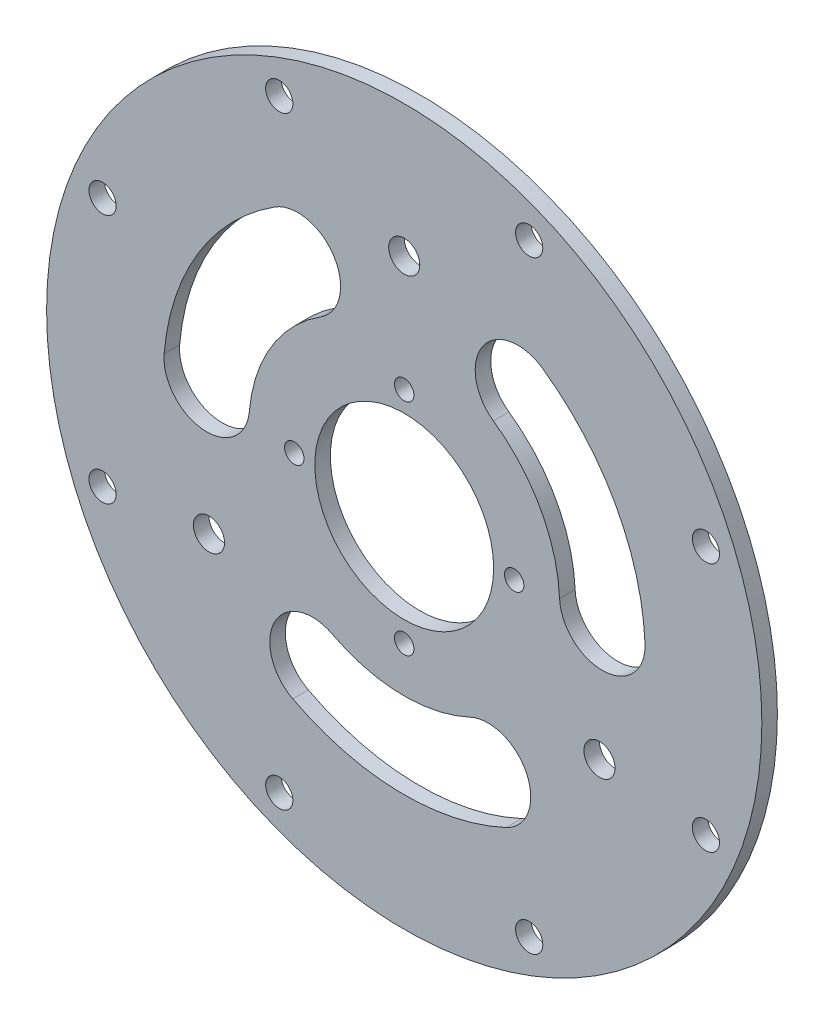
ISO-10303-21;
HEADER;
FILE_DESCRIPTION(('STEP AP214'),'2;1');
FILE_NAME('part.step','',(''),(''),'','','');
FILE_SCHEMA(('AUTOMOTIVE_DESIGN { 1 0 10303 214 1 1 1 1 }'));
ENDSEC;
DATA;
#1=APPLICATION_CONTEXT('core data for automotive mechanical design processes');
#2=APPLICATION_PROTOCOL_DEFINITION('international standard','automotive_design',2000,#1);
#3=PRODUCT_CONTEXT('',#1,'mechanical');
#4=PRODUCT('Part','Part','',(#3));
#5=PRODUCT_RELATED_PRODUCT_CATEGORY('part','',(#4));
#6=PRODUCT_DEFINITION_FORMATION('','',#4);
#7=PRODUCT_DEFINITION_CONTEXT('part definition',#1,'design');
#8=PRODUCT_DEFINITION('design','',#6,#7);
#9=PRODUCT_DEFINITION_SHAPE('','',#8);
#10=(LENGTH_UNIT() NAMED_UNIT(*) SI_UNIT(.MILLI.,.METRE.));
#11=(NAMED_UNIT(*) PLANE_ANGLE_UNIT() SI_UNIT($,.RADIAN.));
#12=(NAMED_UNIT(*) SI_UNIT($,.STERADIAN.) SOLID_ANGLE_UNIT());
#13=UNCERTAINTY_MEASURE_WITH_UNIT(LENGTH_MEASURE(1.E-05),#10,'distance_accuracy_value','');
#14=(GEOMETRIC_REPRESENTATION_CONTEXT(3) GLOBAL_UNCERTAINTY_ASSIGNED_CONTEXT((#13)) GLOBAL_UNIT_ASSIGNED_CONTEXT((#10,
#11,#12)) REPRESENTATION_CONTEXT('',''));
#15=CARTESIAN_POINT('',(0.,0.,0.));
#16=DIRECTION('',(0.,0.,1.));
#17=DIRECTION('',(1.,0.,0.));
#18=AXIS2_PLACEMENT_3D('',#15,#16,#17);
#19=CARTESIAN_POINT('',(0.,0.,2.));
#20=DIRECTION('',(0.,0.,1.));
#21=DIRECTION('',(1.,0.,0.));
#22=AXIS2_PLACEMENT_3D('',#19,#20,#21);
#23=PLANE('',#22);
#24=CARTESIAN_POINT('',(0.,14.1421356237309,2.));
#25=DIRECTION('',(0.,0.,1.));
#26=DIRECTION('',(1.,0.,0.));
#27=AXIS2_PLACEMENT_3D('',#24,#25,#26);
#28=CIRCLE('',#27,1.25);
#29=CARTESIAN_POINT('',(1.25,14.1421356237309,2.));
#30=VERTEX_POINT('',#29);
#31=EDGE_CURVE('E349',#30,#30,#28,.T.);
#32=ORIENTED_EDGE('',*,*,#31,.F.);
#33=EDGE_LOOP('',(#32));
#34=FACE_BOUND('',#33,.T.);
#35=CARTESIAN_POINT('',(14.1421356237309,0.,2.));
#36=DIRECTION('',(0.,0.,1.));
#37=DIRECTION('',(1.,0.,0.));
#38=AXIS2_PLACEMENT_3D('',#35,#36,#37);
#39=CIRCLE('',#38,1.25);
#40=CARTESIAN_POINT('',(15.3921356237309,0.,2.));
#41=VERTEX_POINT('',#40);
#42=EDGE_CURVE('E388',#41,#41,#39,.T.);
#43=ORIENTED_EDGE('',*,*,#42,.F.);
#44=EDGE_LOOP('',(#43));
#45=FACE_BOUND('',#44,.T.);
#46=CARTESIAN_POINT('',(0.,-14.1421356237309,2.));
#47=DIRECTION('',(0.,0.,1.));
#48=DIRECTION('',(1.,0.,0.));
#49=AXIS2_PLACEMENT_3D('',#46,#47,#48);
#50=CIRCLE('',#49,1.25);
#51=CARTESIAN_POINT('',(1.25,-14.1421356237309,2.));
#52=VERTEX_POINT('',#51);
#53=EDGE_CURVE('E392',#52,#52,#50,.T.);
#54=ORIENTED_EDGE('',*,*,#53,.F.);
#55=EDGE_LOOP('',(#54));
#56=FACE_BOUND('',#55,.T.);
#57=CARTESIAN_POINT('',(-14.1421356237309,0.,2.));
#58=DIRECTION('',(0.,0.,1.));
#59=DIRECTION('',(1.,0.,0.));
#60=AXIS2_PLACEMENT_3D('',#57,#58,#59);
#61=CIRCLE('',#60,1.25);
#62=CARTESIAN_POINT('',(-12.8921356237309,0.,2.));
#63=VERTEX_POINT('',#62);
#64=EDGE_CURVE('E395',#63,#63,#61,.T.);
#65=ORIENTED_EDGE('',*,*,#64,.F.);
#66=EDGE_LOOP('',(#65));
#67=FACE_BOUND('',#66,.T.);
#68=CARTESIAN_POINT('',(0.,0.,2.));
#69=DIRECTION('',(0.,0.,1.));
#70=DIRECTION('',(1.,0.,0.));
#71=AXIS2_PLACEMENT_3D('',#68,#69,#70);
#72=CIRCLE('',#71,20.);
#73=CARTESIAN_POINT('',(-19.9238939618349,1.74311485495328,2.));
#74=VERTEX_POINT('',#73);
#75=CARTESIAN_POINT('',(-10.7329743561655,16.8761151178194,2.));
#76=VERTEX_POINT('',#75);
#77=EDGE_CURVE('E11',#74,#76,#72,.F.);
#78=ORIENTED_EDGE('',*,*,#77,.F.);
#79=CARTESIAN_POINT('',(-25.4029648013395,2.22247144006544,2.));
#80=DIRECTION('',(0.,0.,1.));
#81=DIRECTION('',(1.,0.,0.));
#82=AXIS2_PLACEMENT_3D('',#79,#80,#81);
#83=CIRCLE('',#82,5.5);
#84=CARTESIAN_POINT('',(-30.8820356408441,2.70182802517759,2.));
#85=VERTEX_POINT('',#84);
#86=EDGE_CURVE('E56',#85,#74,#83,.T.);
#87=ORIENTED_EDGE('',*,*,#86,.F.);
#88=CARTESIAN_POINT('',(0.,0.,2.));
#89=DIRECTION('',(0.,0.,1.));
#90=DIRECTION('',(1.,0.,0.));
#91=AXIS2_PLACEMENT_3D('',#88,#89,#90);
#92=CIRCLE('',#91,31.);
#93=CARTESIAN_POINT('',(-16.6361102520566,26.1579784326201,2.));
#94=VERTEX_POINT('',#93);
#95=EDGE_CURVE('E339',#94,#85,#92,.T.);
#96=ORIENTED_EDGE('',*,*,#95,.F.);
#97=CARTESIAN_POINT('',(-13.6845423041111,21.5170467752198,2.));
#98=DIRECTION('',(0.,0.,1.));
#99=DIRECTION('',(1.,0.,0.));
#100=AXIS2_PLACEMENT_3D('',#97,#98,#99);
#101=CIRCLE('',#100,5.5);
#102=EDGE_CURVE('E335',#76,#94,#101,.T.);
#103=ORIENTED_EDGE('',*,*,#102,.F.);
#104=EDGE_LOOP('',(#78,#87,#96,#103));
#105=FACE_BOUND('',#104,.T.);
#106=CARTESIAN_POINT('',(0.,0.,2.));
#107=DIRECTION('',(0.,0.,1.));
#108=DIRECTION('',(1.,0.,0.));
#109=AXIS2_PLACEMENT_3D('',#106,#107,#108);
#110=CIRCLE('',#109,46.);
#111=CARTESIAN_POINT('',(46.,0.,2.));
#112=VERTEX_POINT('',#111);
#113=EDGE_CURVE('E331',#112,#112,#110,.T.);
#114=ORIENTED_EDGE('',*,*,#113,.T.);
#115=EDGE_LOOP('',(#114));
#116=FACE_BOUND('',#115,.T.);
#117=CARTESIAN_POINT('',(-25.1147367097487,-14.5,2.));
#118=DIRECTION('',(0.,0.,1.));
#119=DIRECTION('',(1.,0.,0.));
#120=AXIS2_PLACEMENT_3D('',#117,#118,#119);
#121=CIRCLE('',#120,2.);
#122=CARTESIAN_POINT('',(-23.1147367097487,-14.5,2.));
#123=VERTEX_POINT('',#122);
#124=EDGE_CURVE('E327',#123,#123,#121,.T.);
#125=ORIENTED_EDGE('',*,*,#124,.F.);
#126=EDGE_LOOP('',(#125));
#127=FACE_BOUND('',#126,.T.);
#128=CARTESIAN_POINT('',(0.,0.,2.));
#129=DIRECTION('',(0.,0.,1.));
#130=DIRECTION('',(1.,0.,0.));
#131=AXIS2_PLACEMENT_3D('',#128,#129,#130);
#132=CIRCLE('',#131,11.5);
#133=CARTESIAN_POINT('',(11.5,0.,2.));
#134=VERTEX_POINT('',#133);
#135=EDGE_CURVE('E323',#134,#134,#132,.T.);
#136=ORIENTED_EDGE('',*,*,#135,.F.);
#137=EDGE_LOOP('',(#136));
#138=FACE_BOUND('',#137,.T.);
#139=CARTESIAN_POINT('',(0.,29.,2.));
#140=DIRECTION('',(0.,0.,1.));
#141=DIRECTION('',(1.,0.,0.));
#142=AXIS2_PLACEMENT_3D('',#139,#140,#141);
#143=CIRCLE('',#142,2.);
#144=CARTESIAN_POINT('',(2.,29.,2.));
#145=VERTEX_POINT('',#144);
#146=EDGE_CURVE('E319',#145,#145,#143,.T.);
#147=ORIENTED_EDGE('',*,*,#146,.F.);
#148=EDGE_LOOP('',(#147));
#149=FACE_BOUND('',#148,.T.);
#150=CARTESIAN_POINT('',(25.1147367097487,-14.5,2.));
#151=DIRECTION('',(0.,0.,1.));
#152=DIRECTION('',(1.,0.,0.));
#153=AXIS2_PLACEMENT_3D('',#150,#151,#152);
#154=CIRCLE('',#153,2.00000000000001);
#155=CARTESIAN_POINT('',(27.1147367097487,-14.5,2.));
#156=VERTEX_POINT('',#155);
#157=EDGE_CURVE('E315',#156,#156,#154,.T.);
#158=ORIENTED_EDGE('',*,*,#157,.F.);
#159=EDGE_LOOP('',(#158));
#160=FACE_BOUND('',#159,.T.);
#161=CARTESIAN_POINT('',(38.8029403654764,16.072704159339,2.));
#162=DIRECTION('',(0.,0.,1.));
#163=DIRECTION('',(1.,0.,0.));
#164=AXIS2_PLACEMENT_3D('',#161,#162,#163);
#165=CIRCLE('',#164,1.75);
#166=CARTESIAN_POINT('',(40.5529403654764,16.072704159339,2.));
#167=VERTEX_POINT('',#166);
#168=EDGE_CURVE('E311',#167,#167,#165,.T.);
#169=ORIENTED_EDGE('',*,*,#168,.F.);
#170=EDGE_LOOP('',(#169));
#171=FACE_BOUND('',#170,.T.);
#172=CARTESIAN_POINT('',(16.0727041593412,-38.802940365471,2.));
#173=DIRECTION('',(0.,0.,1.));
#174=DIRECTION('',(1.,0.,0.));
#175=AXIS2_PLACEMENT_3D('',#172,#173,#174);
#176=CIRCLE('',#175,1.75);
#177=CARTESIAN_POINT('',(17.8227041593412,-38.802940365471,2.));
#178=VERTEX_POINT('',#177);
#179=EDGE_CURVE('E307',#178,#178,#176,.T.);
#180=ORIENTED_EDGE('',*,*,#179,.F.);
#181=EDGE_LOOP('',(#180));
#182=FACE_BOUND('',#181,.T.);
#183=CARTESIAN_POINT('',(-38.8029403654717,16.0727041593318,2.));
#184=DIRECTION('',(0.,0.,1.));
#185=DIRECTION('',(1.,0.,0.));
#186=AXIS2_PLACEMENT_3D('',#183,#184,#185);
#187=CIRCLE('',#186,1.75);
#188=CARTESIAN_POINT('',(-37.0529403654717,16.0727041593318,2.));
#189=VERTEX_POINT('',#188);
#190=EDGE_CURVE('E304',#189,#189,#187,.T.);
#191=ORIENTED_EDGE('',*,*,#190,.F.);
#192=EDGE_LOOP('',(#191));
#193=FACE_BOUND('',#192,.T.);
#194=CARTESIAN_POINT('',(38.8029403654794,-16.0727041593286,2.));
#195=DIRECTION('',(0.,0.,1.));
#196=DIRECTION('',(1.,0.,0.));
#197=AXIS2_PLACEMENT_3D('',#194,#195,#196);
#198=CIRCLE('',#197,1.75);
#199=CARTESIAN_POINT('',(40.5529403654794,-16.0727041593286,2.));
#200=VERTEX_POINT('',#199);
#201=EDGE_CURVE('E300',#200,#200,#198,.T.);
#202=ORIENTED_EDGE('',*,*,#201,.F.);
#203=EDGE_LOOP('',(#202));
#204=FACE_BOUND('',#203,.T.);
#205=CARTESIAN_POINT('',(-38.8029403654687,-16.0727041593358,2.));
#206=DIRECTION('',(0.,0.,1.));
#207=DIRECTION('',(1.,0.,0.));
#208=AXIS2_PLACEMENT_3D('',#205,#206,#207);
#209=CIRCLE('',#208,1.75);
#210=CARTESIAN_POINT('',(-37.0529403654687,-16.0727041593358,2.));
#211=VERTEX_POINT('',#210);
#212=EDGE_CURVE('E296',#211,#211,#209,.T.);
#213=ORIENTED_EDGE('',*,*,#212,.F.);
#214=EDGE_LOOP('',(#213));
#215=FACE_BOUND('',#214,.T.);
#216=CARTESIAN_POINT('',(-16.0727041593335,38.8029403654741,2.));
#217=DIRECTION('',(0.,0.,1.));
#218=DIRECTION('',(1.,0.,0.));
#219=AXIS2_PLACEMENT_3D('',#216,#217,#218);
#220=CIRCLE('',#219,1.75);
#221=CARTESIAN_POINT('',(-14.3227041593335,38.8029403654741,2.));
#222=VERTEX_POINT('',#221);
#223=EDGE_CURVE('E292',#222,#222,#220,.T.);
#224=ORIENTED_EDGE('',*,*,#223,.F.);
#225=EDGE_LOOP('',(#224));
#226=FACE_BOUND('',#225,.T.);
#227=CARTESIAN_POINT('',(-16.0727041593263,-38.8029403654739,2.));
#228=DIRECTION('',(0.,0.,1.));
#229=DIRECTION('',(1.,0.,0.));
#230=AXIS2_PLACEMENT_3D('',#227,#228,#229);
#231=CIRCLE('',#230,1.75);
#232=CARTESIAN_POINT('',(-14.3227041593263,-38.8029403654739,2.));
#233=VERTEX_POINT('',#232);
#234=EDGE_CURVE('E288',#233,#233,#231,.T.);
#235=ORIENTED_EDGE('',*,*,#234,.F.);
#236=EDGE_LOOP('',(#235));
#237=FACE_BOUND('',#236,.T.);
#238=CARTESIAN_POINT('',(16.072704159334,38.8029403654771,2.));
#239=DIRECTION('',(0.,0.,1.));
#240=DIRECTION('',(1.,0.,0.));
#241=AXIS2_PLACEMENT_3D('',#238,#239,#240);
#242=CIRCLE('',#241,1.75);
#243=CARTESIAN_POINT('',(17.822704159334,38.8029403654771,2.));
#244=VERTEX_POINT('',#243);
#245=EDGE_CURVE('E284',#244,#244,#242,.T.);
#246=ORIENTED_EDGE('',*,*,#245,.F.);
#247=EDGE_LOOP('',(#246));
#248=FACE_BOUND('',#247,.T.);
#249=CARTESIAN_POINT('',(25.4765802738139,1.09263788691314,2.));
#250=DIRECTION('',(0.,0.,1.));
#251=DIRECTION('',(1.,0.,0.));
#252=AXIS2_PLACEMENT_3D('',#249,#250,#251);
#253=CIRCLE('',#252,5.5);
#254=CARTESIAN_POINT('',(19.981631587305,0.85697089169658,2.));
#255=VERTEX_POINT('',#254);
#256=CARTESIAN_POINT('',(30.9715289603227,1.3283048821297,2.));
#257=VERTEX_POINT('',#256);
#258=EDGE_CURVE('E280',#255,#257,#253,.T.);
#259=ORIENTED_EDGE('',*,*,#258,.F.);
#260=CARTESIAN_POINT('',(0.,0.,2.));
#261=DIRECTION('',(0.,0.,1.));
#262=DIRECTION('',(1.,0.,0.));
#263=AXIS2_PLACEMENT_3D('',#260,#261,#262);
#264=CIRCLE('',#263,20.);
#265=CARTESIAN_POINT('',(11.471528727021,16.3830408857798,2.));
#266=VERTEX_POINT('',#265);
#267=EDGE_CURVE('E276',#266,#255,#264,.F.);
#268=ORIENTED_EDGE('',*,*,#267,.F.);
#269=CARTESIAN_POINT('',(14.6261991269518,20.8883771293692,2.));
#270=DIRECTION('',(0.,0.,1.));
#271=DIRECTION('',(1.,0.,0.));
#272=AXIS2_PLACEMENT_3D('',#269,#270,#271);
#273=CIRCLE('',#272,5.5);
#274=CARTESIAN_POINT('',(17.7808695268826,25.3937133729586,2.));
#275=VERTEX_POINT('',#274);
#276=EDGE_CURVE('E272',#275,#266,#273,.T.);
#277=ORIENTED_EDGE('',*,*,#276,.F.);
#278=CARTESIAN_POINT('',(0.,0.,2.));
#279=DIRECTION('',(0.,0.,1.));
#280=DIRECTION('',(1.,0.,0.));
#281=AXIS2_PLACEMENT_3D('',#278,#279,#280);
#282=CIRCLE('',#281,31.);
#283=EDGE_CURVE('E268',#257,#275,#282,.T.);
#284=ORIENTED_EDGE('',*,*,#283,.F.);
#285=EDGE_LOOP('',(#259,#268,#277,#284));
#286=FACE_BOUND('',#285,.T.);
#287=CARTESIAN_POINT('',(0.,0.,2.));
#288=DIRECTION('',(0.,0.,1.));
#289=DIRECTION('',(1.,0.,0.));
#290=AXIS2_PLACEMENT_3D('',#287,#288,#289);
#291=CIRCLE('',#290,20.);
#292=CARTESIAN_POINT('',(8.45236523481387,-18.1261557407331,2.));
#293=VERTEX_POINT('',#292);
#294=CARTESIAN_POINT('',(-9.24865723113947,-17.733086009516,2.));
#295=VERTEX_POINT('',#294);
#296=EDGE_CURVE('E264',#293,#295,#291,.F.);
#297=ORIENTED_EDGE('',*,*,#296,.F.);
#298=CARTESIAN_POINT('',(10.7767656743877,-23.1108485694346,2.));
#299=DIRECTION('',(0.,0.,1.));
#300=DIRECTION('',(1.,0.,0.));
#301=AXIS2_PLACEMENT_3D('',#298,#299,#300);
#302=CIRCLE('',#301,5.5);
#303=CARTESIAN_POINT('',(13.1011661139615,-28.0955413981362,2.));
#304=VERTEX_POINT('',#303);
#305=EDGE_CURVE('E261',#304,#293,#302,.T.);
#306=ORIENTED_EDGE('',*,*,#305,.F.);
#307=CARTESIAN_POINT('',(0.,0.,2.));
#308=DIRECTION('',(0.,0.,1.));
#309=DIRECTION('',(1.,0.,0.));
#310=AXIS2_PLACEMENT_3D('',#307,#308,#309);
#311=CIRCLE('',#310,31.);
#312=CARTESIAN_POINT('',(-14.3354187082662,-27.4862833147498,2.));
#313=VERTEX_POINT('',#312);
#314=EDGE_CURVE('E151',#313,#304,#311,.T.);
#315=ORIENTED_EDGE('',*,*,#314,.F.);
#316=CARTESIAN_POINT('',(-11.7920379697028,-22.6096846621329,2.));
#317=DIRECTION('',(0.,0.,1.));
#318=DIRECTION('',(1.,0.,0.));
#319=AXIS2_PLACEMENT_3D('',#316,#317,#318);
#320=CIRCLE('',#319,5.5);
#321=EDGE_CURVE('E255',#295,#313,#320,.T.);
#322=ORIENTED_EDGE('',*,*,#321,.F.);
#323=EDGE_LOOP('',(#297,#306,#315,#322));
#324=FACE_BOUND('',#323,.T.);
#325=ADVANCED_FACE('F47',(#34,#45,#56,#67,#105,#116,#127,#138,#149,#160,#171,#182,#193,#204,
#215,#226,#237,#248,#286,#324),#23,.T.);
#326=CARTESIAN_POINT('',(0.,0.,0.));
#327=DIRECTION('',(0.,0.,1.));
#328=DIRECTION('',(1.,0.,0.));
#329=AXIS2_PLACEMENT_3D('',#326,#327,#328);
#330=PLANE('',#329);
#331=CARTESIAN_POINT('',(0.,14.1421356237309,0.));
#332=DIRECTION('',(0.,0.,1.));
#333=DIRECTION('',(1.,0.,0.));
#334=AXIS2_PLACEMENT_3D('',#331,#332,#333);
#335=CIRCLE('',#334,1.25);
#336=CARTESIAN_POINT('',(1.25,14.1421356237309,0.));
#337=VERTEX_POINT('',#336);
#338=EDGE_CURVE('E50',#337,#337,#335,.T.);
#339=ORIENTED_EDGE('',*,*,#338,.T.);
#340=EDGE_LOOP('',(#339));
#341=FACE_BOUND('',#340,.T.);
#342=CARTESIAN_POINT('',(14.1421356237309,0.,0.));
#343=DIRECTION('',(0.,0.,1.));
#344=DIRECTION('',(1.,0.,0.));
#345=AXIS2_PLACEMENT_3D('',#342,#343,#344);
#346=CIRCLE('',#345,1.25);
#347=CARTESIAN_POINT('',(15.3921356237309,0.,0.));
#348=VERTEX_POINT('',#347);
#349=EDGE_CURVE('E352',#348,#348,#346,.T.);
#350=ORIENTED_EDGE('',*,*,#349,.T.);
#351=EDGE_LOOP('',(#350));
#352=FACE_BOUND('',#351,.T.);
#353=CARTESIAN_POINT('',(0.,-14.1421356237309,0.));
#354=DIRECTION('',(0.,0.,1.));
#355=DIRECTION('',(1.,0.,0.));
#356=AXIS2_PLACEMENT_3D('',#353,#354,#355);
#357=CIRCLE('',#356,1.25);
#358=CARTESIAN_POINT('',(1.25,-14.1421356237309,0.));
#359=VERTEX_POINT('',#358);
#360=EDGE_CURVE('E348',#359,#359,#357,.T.);
#361=ORIENTED_EDGE('',*,*,#360,.T.);
#362=EDGE_LOOP('',(#361));
#363=FACE_BOUND('',#362,.T.);
#364=CARTESIAN_POINT('',(-14.1421356237309,0.,0.));
#365=DIRECTION('',(0.,0.,1.));
#366=DIRECTION('',(1.,0.,0.));
#367=AXIS2_PLACEMENT_3D('',#364,#365,#366);
#368=CIRCLE('',#367,1.25);
#369=CARTESIAN_POINT('',(-12.8921356237309,0.,0.));
#370=VERTEX_POINT('',#369);
#371=EDGE_CURVE('E344',#370,#370,#368,.T.);
#372=ORIENTED_EDGE('',*,*,#371,.T.);
#373=EDGE_LOOP('',(#372));
#374=FACE_BOUND('',#373,.T.);
#375=CARTESIAN_POINT('',(16.072704159334,38.8029403654771,0.));
#376=DIRECTION('',(0.,0.,1.));
#377=DIRECTION('',(1.,0.,0.));
#378=AXIS2_PLACEMENT_3D('',#375,#376,#377);
#379=CIRCLE('',#378,1.75);
#380=CARTESIAN_POINT('',(17.822704159334,38.8029403654771,0.));
#381=VERTEX_POINT('',#380);
#382=EDGE_CURVE('E251',#381,#381,#379,.T.);
#383=ORIENTED_EDGE('',*,*,#382,.T.);
#384=EDGE_LOOP('',(#383));
#385=FACE_BOUND('',#384,.T.);
#386=CARTESIAN_POINT('',(-16.0727041593263,-38.8029403654739,0.));
#387=DIRECTION('',(0.,0.,1.));
#388=DIRECTION('',(1.,0.,0.));
#389=AXIS2_PLACEMENT_3D('',#386,#387,#388);
#390=CIRCLE('',#389,1.75);
#391=CARTESIAN_POINT('',(-14.3227041593263,-38.8029403654739,0.));
#392=VERTEX_POINT('',#391);
#393=EDGE_CURVE('E247',#392,#392,#390,.T.);
#394=ORIENTED_EDGE('',*,*,#393,.T.);
#395=EDGE_LOOP('',(#394));
#396=FACE_BOUND('',#395,.T.);
#397=CARTESIAN_POINT('',(-16.0727041593335,38.8029403654741,0.));
#398=DIRECTION('',(0.,0.,1.));
#399=DIRECTION('',(1.,0.,0.));
#400=AXIS2_PLACEMENT_3D('',#397,#398,#399);
#401=CIRCLE('',#400,1.75);
#402=CARTESIAN_POINT('',(-14.3227041593335,38.8029403654741,0.));
#403=VERTEX_POINT('',#402);
#404=EDGE_CURVE('E243',#403,#403,#401,.T.);
#405=ORIENTED_EDGE('',*,*,#404,.T.);
#406=EDGE_LOOP('',(#405));
#407=FACE_BOUND('',#406,.T.);
#408=CARTESIAN_POINT('',(-38.8029403654687,-16.0727041593358,0.));
#409=DIRECTION('',(0.,0.,1.));
#410=DIRECTION('',(1.,0.,0.));
#411=AXIS2_PLACEMENT_3D('',#408,#409,#410);
#412=CIRCLE('',#411,1.75);
#413=CARTESIAN_POINT('',(-37.0529403654687,-16.0727041593358,0.));
#414=VERTEX_POINT('',#413);
#415=EDGE_CURVE('E239',#414,#414,#412,.T.);
#416=ORIENTED_EDGE('',*,*,#415,.T.);
#417=EDGE_LOOP('',(#416));
#418=FACE_BOUND('',#417,.T.);
#419=CARTESIAN_POINT('',(38.8029403654794,-16.0727041593286,0.));
#420=DIRECTION('',(0.,0.,1.));
#421=DIRECTION('',(1.,0.,0.));
#422=AXIS2_PLACEMENT_3D('',#419,#420,#421);
#423=CIRCLE('',#422,1.75);
#424=CARTESIAN_POINT('',(40.5529403654794,-16.0727041593286,0.));
#425=VERTEX_POINT('',#424);
#426=EDGE_CURVE('E235',#425,#425,#423,.T.);
#427=ORIENTED_EDGE('',*,*,#426,.T.);
#428=EDGE_LOOP('',(#427));
#429=FACE_BOUND('',#428,.T.);
#430=CARTESIAN_POINT('',(-38.8029403654717,16.0727041593318,0.));
#431=DIRECTION('',(0.,0.,1.));
#432=DIRECTION('',(1.,0.,0.));
#433=AXIS2_PLACEMENT_3D('',#430,#431,#432);
#434=CIRCLE('',#433,1.75);
#435=CARTESIAN_POINT('',(-37.0529403654717,16.0727041593318,0.));
#436=VERTEX_POINT('',#435);
#437=EDGE_CURVE('E231',#436,#436,#434,.T.);
#438=ORIENTED_EDGE('',*,*,#437,.T.);
#439=EDGE_LOOP('',(#438));
#440=FACE_BOUND('',#439,.T.);
#441=CARTESIAN_POINT('',(16.0727041593412,-38.802940365471,0.));
#442=DIRECTION('',(0.,0.,1.));
#443=DIRECTION('',(1.,0.,0.));
#444=AXIS2_PLACEMENT_3D('',#441,#442,#443);
#445=CIRCLE('',#444,1.75);
#446=CARTESIAN_POINT('',(17.8227041593412,-38.802940365471,0.));
#447=VERTEX_POINT('',#446);
#448=EDGE_CURVE('E227',#447,#447,#445,.T.);
#449=ORIENTED_EDGE('',*,*,#448,.T.);
#450=EDGE_LOOP('',(#449));
#451=FACE_BOUND('',#450,.T.);
#452=CARTESIAN_POINT('',(38.8029403654764,16.072704159339,0.));
#453=DIRECTION('',(0.,0.,1.));
#454=DIRECTION('',(1.,0.,0.));
#455=AXIS2_PLACEMENT_3D('',#452,#453,#454);
#456=CIRCLE('',#455,1.75);
#457=CARTESIAN_POINT('',(40.5529403654764,16.072704159339,0.));
#458=VERTEX_POINT('',#457);
#459=EDGE_CURVE('E223',#458,#458,#456,.T.);
#460=ORIENTED_EDGE('',*,*,#459,.T.);
#461=EDGE_LOOP('',(#460));
#462=FACE_BOUND('',#461,.T.);
#463=CARTESIAN_POINT('',(-25.1147367097487,-14.5,0.));
#464=DIRECTION('',(0.,0.,1.));
#465=DIRECTION('',(1.,0.,0.));
#466=AXIS2_PLACEMENT_3D('',#463,#464,#465);
#467=CIRCLE('',#466,2.);
#468=CARTESIAN_POINT('',(-23.1147367097487,-14.5,0.));
#469=VERTEX_POINT('',#468);
#470=EDGE_CURVE('E219',#469,#469,#467,.T.);
#471=ORIENTED_EDGE('',*,*,#470,.T.);
#472=EDGE_LOOP('',(#471));
#473=FACE_BOUND('',#472,.T.);
#474=CARTESIAN_POINT('',(25.1147367097487,-14.5,0.));
#475=DIRECTION('',(0.,0.,1.));
#476=DIRECTION('',(1.,0.,0.));
#477=AXIS2_PLACEMENT_3D('',#474,#475,#476);
#478=CIRCLE('',#477,2.00000000000001);
#479=CARTESIAN_POINT('',(27.1147367097487,-14.5,0.));
#480=VERTEX_POINT('',#479);
#481=EDGE_CURVE('E215',#480,#480,#478,.T.);
#482=ORIENTED_EDGE('',*,*,#481,.T.);
#483=EDGE_LOOP('',(#482));
#484=FACE_BOUND('',#483,.T.);
#485=CARTESIAN_POINT('',(0.,29.,0.));
#486=DIRECTION('',(0.,0.,1.));
#487=DIRECTION('',(1.,0.,0.));
#488=AXIS2_PLACEMENT_3D('',#485,#486,#487);
#489=CIRCLE('',#488,2.);
#490=CARTESIAN_POINT('',(2.,29.,0.));
#491=VERTEX_POINT('',#490);
#492=EDGE_CURVE('E211',#491,#491,#489,.T.);
#493=ORIENTED_EDGE('',*,*,#492,.T.);
#494=EDGE_LOOP('',(#493));
#495=FACE_BOUND('',#494,.T.);
#496=CARTESIAN_POINT('',(0.,0.,0.));
#497=DIRECTION('',(0.,0.,1.));
#498=DIRECTION('',(1.,0.,0.));
#499=AXIS2_PLACEMENT_3D('',#496,#497,#498);
#500=CIRCLE('',#499,11.5);
#501=CARTESIAN_POINT('',(11.5,0.,0.));
#502=VERTEX_POINT('',#501);
#503=EDGE_CURVE('E207',#502,#502,#500,.T.);
#504=ORIENTED_EDGE('',*,*,#503,.T.);
#505=EDGE_LOOP('',(#504));
#506=FACE_BOUND('',#505,.T.);
#507=CARTESIAN_POINT('',(0.,0.,0.));
#508=DIRECTION('',(0.,0.,1.));
#509=DIRECTION('',(1.,0.,0.));
#510=AXIS2_PLACEMENT_3D('',#507,#508,#509);
#511=CIRCLE('',#510,46.);
#512=CARTESIAN_POINT('',(46.,0.,0.));
#513=VERTEX_POINT('',#512);
#514=EDGE_CURVE('E203',#513,#513,#511,.T.);
#515=ORIENTED_EDGE('',*,*,#514,.F.);
#516=EDGE_LOOP('',(#515));
#517=FACE_BOUND('',#516,.T.);
#518=CARTESIAN_POINT('',(0.,0.,0.));
#519=DIRECTION('',(0.,0.,1.));
#520=DIRECTION('',(-1.,0.,0.));
#521=AXIS2_PLACEMENT_3D('',#518,#519,#520);
#522=CIRCLE('',#521,20.);
#523=CARTESIAN_POINT('',(19.981631587305,0.85697089169658,0.));
#524=VERTEX_POINT('',#523);
#525=CARTESIAN_POINT('',(11.471528727021,16.3830408857798,0.));
#526=VERTEX_POINT('',#525);
#527=EDGE_CURVE('E199',#524,#526,#522,.T.);
#528=ORIENTED_EDGE('',*,*,#527,.F.);
#529=CARTESIAN_POINT('',(25.4765802738139,1.09263788691314,0.));
#530=DIRECTION('',(0.,0.,-1.));
#531=DIRECTION('',(-1.,0.,0.));
#532=AXIS2_PLACEMENT_3D('',#529,#530,#531);
#533=CIRCLE('',#532,5.5);
#534=CARTESIAN_POINT('',(30.9715289603227,1.3283048821297,0.));
#535=VERTEX_POINT('',#534);
#536=EDGE_CURVE('E195',#535,#524,#533,.T.);
#537=ORIENTED_EDGE('',*,*,#536,.F.);
#538=CARTESIAN_POINT('',(0.,0.,0.));
#539=DIRECTION('',(0.,0.,-1.));
#540=DIRECTION('',(-1.,0.,0.));
#541=AXIS2_PLACEMENT_3D('',#538,#539,#540);
#542=CIRCLE('',#541,31.);
#543=CARTESIAN_POINT('',(17.7808695268826,25.3937133729586,0.));
#544=VERTEX_POINT('',#543);
#545=EDGE_CURVE('E191',#544,#535,#542,.T.);
#546=ORIENTED_EDGE('',*,*,#545,.F.);
#547=CARTESIAN_POINT('',(14.6261991269518,20.8883771293692,0.));
#548=DIRECTION('',(0.,0.,-1.));
#549=DIRECTION('',(-1.,0.,0.));
#550=AXIS2_PLACEMENT_3D('',#547,#548,#549);
#551=CIRCLE('',#550,5.5);
#552=EDGE_CURVE('E187',#526,#544,#551,.T.);
#553=ORIENTED_EDGE('',*,*,#552,.F.);
#554=EDGE_LOOP('',(#528,#537,#546,#553));
#555=FACE_BOUND('',#554,.T.);
#556=CARTESIAN_POINT('',(-25.4029648013395,2.22247144006544,0.));
#557=DIRECTION('',(0.,0.,-1.));
#558=DIRECTION('',(-1.,0.,0.));
#559=AXIS2_PLACEMENT_3D('',#556,#557,#558);
#560=CIRCLE('',#559,5.5);
#561=CARTESIAN_POINT('',(-19.9238939618349,1.74311485495328,0.));
#562=VERTEX_POINT('',#561);
#563=CARTESIAN_POINT('',(-30.8820356408441,2.70182802517759,0.));
#564=VERTEX_POINT('',#563);
#565=EDGE_CURVE('E183',#562,#564,#560,.T.);
#566=ORIENTED_EDGE('',*,*,#565,.F.);
#567=CARTESIAN_POINT('',(0.,0.,0.));
#568=DIRECTION('',(0.,0.,1.));
#569=DIRECTION('',(-1.,0.,0.));
#570=AXIS2_PLACEMENT_3D('',#567,#568,#569);
#571=CIRCLE('',#570,20.);
#572=CARTESIAN_POINT('',(-10.7329743561655,16.8761151178194,0.));
#573=VERTEX_POINT('',#572);
#574=EDGE_CURVE('E179',#573,#562,#571,.T.);
#575=ORIENTED_EDGE('',*,*,#574,.F.);
#576=CARTESIAN_POINT('',(-13.6845423041111,21.5170467752198,0.));
#577=DIRECTION('',(0.,0.,-1.));
#578=DIRECTION('',(-1.,0.,0.));
#579=AXIS2_PLACEMENT_3D('',#576,#577,#578);
#580=CIRCLE('',#579,5.5);
#581=CARTESIAN_POINT('',(-16.6361102520566,26.1579784326201,0.));
#582=VERTEX_POINT('',#581);
#583=EDGE_CURVE('E170',#582,#573,#580,.T.);
#584=ORIENTED_EDGE('',*,*,#583,.F.);
#585=CARTESIAN_POINT('',(0.,0.,0.));
#586=DIRECTION('',(0.,0.,-1.));
#587=DIRECTION('',(-1.,0.,0.));
#588=AXIS2_PLACEMENT_3D('',#585,#586,#587);
#589=CIRCLE('',#588,31.);
#590=EDGE_CURVE('E162',#564,#582,#589,.T.);
#591=ORIENTED_EDGE('',*,*,#590,.F.);
#592=EDGE_LOOP('',(#566,#575,#584,#591));
#593=FACE_BOUND('',#592,.T.);
#594=CARTESIAN_POINT('',(10.7767656743877,-23.1108485694346,0.));
#595=DIRECTION('',(0.,0.,-1.));
#596=DIRECTION('',(-1.,0.,0.));
#597=AXIS2_PLACEMENT_3D('',#594,#595,#596);
#598=CIRCLE('',#597,5.5);
#599=CARTESIAN_POINT('',(8.45236523481387,-18.1261557407331,0.));
#600=VERTEX_POINT('',#599);
#601=CARTESIAN_POINT('',(13.1011661139615,-28.0955413981362,0.));
#602=VERTEX_POINT('',#601);
#603=EDGE_CURVE('E137',#600,#602,#598,.T.);
#604=ORIENTED_EDGE('',*,*,#603,.F.);
#605=CARTESIAN_POINT('',(0.,0.,0.));
#606=DIRECTION('',(0.,0.,1.));
#607=DIRECTION('',(-1.,0.,0.));
#608=AXIS2_PLACEMENT_3D('',#605,#606,#607);
#609=CIRCLE('',#608,20.);
#610=CARTESIAN_POINT('',(-9.24865723113947,-17.733086009516,0.));
#611=VERTEX_POINT('',#610);
#612=EDGE_CURVE('E163',#611,#600,#609,.T.);
#613=ORIENTED_EDGE('',*,*,#612,.F.);
#614=CARTESIAN_POINT('',(-11.7920379697028,-22.6096846621329,0.));
#615=DIRECTION('',(0.,0.,-1.));
#616=DIRECTION('',(-1.,0.,0.));
#617=AXIS2_PLACEMENT_3D('',#614,#615,#616);
#618=CIRCLE('',#617,5.5);
#619=CARTESIAN_POINT('',(-14.3354187082662,-27.4862833147498,0.));
#620=VERTEX_POINT('',#619);
#621=EDGE_CURVE('E140',#620,#611,#618,.T.);
#622=ORIENTED_EDGE('',*,*,#621,.F.);
#623=CARTESIAN_POINT('',(0.,0.,0.));
#624=DIRECTION('',(0.,0.,-1.));
#625=DIRECTION('',(-1.,0.,0.));
#626=AXIS2_PLACEMENT_3D('',#623,#624,#625);
#627=CIRCLE('',#626,31.);
#628=EDGE_CURVE('E133',#602,#620,#627,.T.);
#629=ORIENTED_EDGE('',*,*,#628,.F.);
#630=EDGE_LOOP('',(#604,#613,#622,#629));
#631=FACE_BOUND('',#630,.T.);
#632=ADVANCED_FACE('F135',(#341,#352,#363,#374,#385,#396,#407,#418,#429,#440,#451,#462,#473,
#484,#495,#506,#517,#555,#593,#631),#330,.F.);
#633=CARTESIAN_POINT('',(0.,0.,2.));
#634=DIRECTION('',(0.,0.,-1.));
#635=DIRECTION('',(-1.,0.,0.));
#636=AXIS2_PLACEMENT_3D('',#633,#634,#635);
#637=CYLINDRICAL_SURFACE('',#636,11.5);
#638=ORIENTED_EDGE('',*,*,#135,.T.);
#639=EDGE_LOOP('',(#638));
#640=FACE_BOUND('',#639,.T.);
#641=ORIENTED_EDGE('',*,*,#503,.F.);
#642=EDGE_LOOP('',(#641));
#643=FACE_BOUND('',#642,.T.);
#644=ADVANCED_FACE('F382',(#640,#643),#637,.F.);
#645=CARTESIAN_POINT('',(0.,29.,2.));
#646=DIRECTION('',(0.,0.,-1.));
#647=DIRECTION('',(-1.,0.,0.));
#648=AXIS2_PLACEMENT_3D('',#645,#646,#647);
#649=CYLINDRICAL_SURFACE('',#648,2.);
#650=ORIENTED_EDGE('',*,*,#146,.T.);
#651=EDGE_LOOP('',(#650));
#652=FACE_BOUND('',#651,.T.);
#653=ORIENTED_EDGE('',*,*,#492,.F.);
#654=EDGE_LOOP('',(#653));
#655=FACE_BOUND('',#654,.T.);
#656=ADVANCED_FACE('F555',(#652,#655),#649,.F.);
#657=CARTESIAN_POINT('',(25.1147367097487,-14.5,2.));
#658=DIRECTION('',(0.,0.,-1.));
#659=DIRECTION('',(-1.,0.,0.));
#660=AXIS2_PLACEMENT_3D('',#657,#658,#659);
#661=CYLINDRICAL_SURFACE('',#660,2.00000000000001);
#662=ORIENTED_EDGE('',*,*,#157,.T.);
#663=EDGE_LOOP('',(#662));
#664=FACE_BOUND('',#663,.T.);
#665=ORIENTED_EDGE('',*,*,#481,.F.);
#666=EDGE_LOOP('',(#665));
#667=FACE_BOUND('',#666,.T.);
#668=ADVANCED_FACE('F551',(#664,#667),#661,.F.);
#669=CARTESIAN_POINT('',(-25.1147367097487,-14.5,2.));
#670=DIRECTION('',(0.,0.,-1.));
#671=DIRECTION('',(-1.,0.,0.));
#672=AXIS2_PLACEMENT_3D('',#669,#670,#671);
#673=CYLINDRICAL_SURFACE('',#672,2.);
#674=ORIENTED_EDGE('',*,*,#124,.T.);
#675=EDGE_LOOP('',(#674));
#676=FACE_BOUND('',#675,.T.);
#677=ORIENTED_EDGE('',*,*,#470,.F.);
#678=EDGE_LOOP('',(#677));
#679=FACE_BOUND('',#678,.T.);
#680=ADVANCED_FACE('F547',(#676,#679),#673,.F.);
#681=CARTESIAN_POINT('',(0.,0.,-8.));
#682=DIRECTION('',(0.,0.,1.));
#683=DIRECTION('',(1.,0.,0.));
#684=AXIS2_PLACEMENT_3D('',#681,#682,#683);
#685=CYLINDRICAL_SURFACE('',#684,46.);
#686=ORIENTED_EDGE('',*,*,#113,.F.);
#687=EDGE_LOOP('',(#686));
#688=FACE_BOUND('',#687,.T.);
#689=ORIENTED_EDGE('',*,*,#514,.T.);
#690=EDGE_LOOP('',(#689));
#691=FACE_BOUND('',#690,.T.);
#692=ADVANCED_FACE('F543',(#688,#691),#685,.T.);
#693=CARTESIAN_POINT('',(38.8029403654764,16.072704159339,-8.));
#694=DIRECTION('',(0.,0.,1.));
#695=DIRECTION('',(1.,0.,0.));
#696=AXIS2_PLACEMENT_3D('',#693,#694,#695);
#697=CYLINDRICAL_SURFACE('',#696,1.75);
#698=ORIENTED_EDGE('',*,*,#168,.T.);
#699=EDGE_LOOP('',(#698));
#700=FACE_BOUND('',#699,.T.);
#701=ORIENTED_EDGE('',*,*,#459,.F.);
#702=EDGE_LOOP('',(#701));
#703=FACE_BOUND('',#702,.T.);
#704=ADVANCED_FACE('F539',(#700,#703),#697,.F.);
#705=CARTESIAN_POINT('',(16.0727041593412,-38.802940365471,-8.));
#706=DIRECTION('',(0.,0.,1.));
#707=DIRECTION('',(1.,0.,0.));
#708=AXIS2_PLACEMENT_3D('',#705,#706,#707);
#709=CYLINDRICAL_SURFACE('',#708,1.75);
#710=ORIENTED_EDGE('',*,*,#179,.T.);
#711=EDGE_LOOP('',(#710));
#712=FACE_BOUND('',#711,.T.);
#713=ORIENTED_EDGE('',*,*,#448,.F.);
#714=EDGE_LOOP('',(#713));
#715=FACE_BOUND('',#714,.T.);
#716=ADVANCED_FACE('F535',(#712,#715),#709,.F.);
#717=CARTESIAN_POINT('',(-38.8029403654717,16.0727041593318,-8.));
#718=DIRECTION('',(0.,0.,1.));
#719=DIRECTION('',(1.,0.,0.));
#720=AXIS2_PLACEMENT_3D('',#717,#718,#719);
#721=CYLINDRICAL_SURFACE('',#720,1.75);
#722=ORIENTED_EDGE('',*,*,#190,.T.);
#723=EDGE_LOOP('',(#722));
#724=FACE_BOUND('',#723,.T.);
#725=ORIENTED_EDGE('',*,*,#437,.F.);
#726=EDGE_LOOP('',(#725));
#727=FACE_BOUND('',#726,.T.);
#728=ADVANCED_FACE('F531',(#724,#727),#721,.F.);
#729=CARTESIAN_POINT('',(38.8029403654794,-16.0727041593286,-8.));
#730=DIRECTION('',(0.,0.,1.));
#731=DIRECTION('',(1.,0.,0.));
#732=AXIS2_PLACEMENT_3D('',#729,#730,#731);
#733=CYLINDRICAL_SURFACE('',#732,1.75);
#734=ORIENTED_EDGE('',*,*,#201,.T.);
#735=EDGE_LOOP('',(#734));
#736=FACE_BOUND('',#735,.T.);
#737=ORIENTED_EDGE('',*,*,#426,.F.);
#738=EDGE_LOOP('',(#737));
#739=FACE_BOUND('',#738,.T.);
#740=ADVANCED_FACE('F527',(#736,#739),#733,.F.);
#741=CARTESIAN_POINT('',(-38.8029403654687,-16.0727041593358,-8.));
#742=DIRECTION('',(0.,0.,1.));
#743=DIRECTION('',(1.,0.,0.));
#744=AXIS2_PLACEMENT_3D('',#741,#742,#743);
#745=CYLINDRICAL_SURFACE('',#744,1.75);
#746=ORIENTED_EDGE('',*,*,#212,.T.);
#747=EDGE_LOOP('',(#746));
#748=FACE_BOUND('',#747,.T.);
#749=ORIENTED_EDGE('',*,*,#415,.F.);
#750=EDGE_LOOP('',(#749));
#751=FACE_BOUND('',#750,.T.);
#752=ADVANCED_FACE('F523',(#748,#751),#745,.F.);
#753=CARTESIAN_POINT('',(-16.0727041593335,38.8029403654741,-8.));
#754=DIRECTION('',(0.,0.,1.));
#755=DIRECTION('',(1.,0.,0.));
#756=AXIS2_PLACEMENT_3D('',#753,#754,#755);
#757=CYLINDRICAL_SURFACE('',#756,1.75);
#758=ORIENTED_EDGE('',*,*,#223,.T.);
#759=EDGE_LOOP('',(#758));
#760=FACE_BOUND('',#759,.T.);
#761=ORIENTED_EDGE('',*,*,#404,.F.);
#762=EDGE_LOOP('',(#761));
#763=FACE_BOUND('',#762,.T.);
#764=ADVANCED_FACE('F519',(#760,#763),#757,.F.);
#765=CARTESIAN_POINT('',(-16.0727041593263,-38.8029403654739,-8.));
#766=DIRECTION('',(0.,0.,1.));
#767=DIRECTION('',(1.,0.,0.));
#768=AXIS2_PLACEMENT_3D('',#765,#766,#767);
#769=CYLINDRICAL_SURFACE('',#768,1.75);
#770=ORIENTED_EDGE('',*,*,#234,.T.);
#771=EDGE_LOOP('',(#770));
#772=FACE_BOUND('',#771,.T.);
#773=ORIENTED_EDGE('',*,*,#393,.F.);
#774=EDGE_LOOP('',(#773));
#775=FACE_BOUND('',#774,.T.);
#776=ADVANCED_FACE('F515',(#772,#775),#769,.F.);
#777=CARTESIAN_POINT('',(16.072704159334,38.8029403654771,-8.));
#778=DIRECTION('',(0.,0.,1.));
#779=DIRECTION('',(1.,0.,0.));
#780=AXIS2_PLACEMENT_3D('',#777,#778,#779);
#781=CYLINDRICAL_SURFACE('',#780,1.75);
#782=ORIENTED_EDGE('',*,*,#245,.T.);
#783=EDGE_LOOP('',(#782));
#784=FACE_BOUND('',#783,.T.);
#785=ORIENTED_EDGE('',*,*,#382,.F.);
#786=EDGE_LOOP('',(#785));
#787=FACE_BOUND('',#786,.T.);
#788=ADVANCED_FACE('F511',(#784,#787),#781,.F.);
#789=CARTESIAN_POINT('',(25.4765802738139,1.09263788691314,10.));
#790=DIRECTION('',(0.,0.,-1.));
#791=DIRECTION('',(-1.,0.,0.));
#792=AXIS2_PLACEMENT_3D('',#789,#790,#791);
#793=CYLINDRICAL_SURFACE('',#792,5.5);
#794=ORIENTED_EDGE('',*,*,#258,.T.);
#795=DIRECTION('',(0.,0.,-1.));
#796=VECTOR('',#795,1.);
#797=CARTESIAN_POINT('',(30.9715289603227,1.3283048821297,10.));
#798=LINE('',#797,#796);
#799=EDGE_CURVE('E145',#257,#535,#798,.T.);
#800=ORIENTED_EDGE('',*,*,#799,.T.);
#801=ORIENTED_EDGE('',*,*,#536,.T.);
#802=DIRECTION('',(0.,0.,-1.));
#803=VECTOR('',#802,1.);
#804=CARTESIAN_POINT('',(19.981631587305,0.85697089169658,10.));
#805=LINE('',#804,#803);
#806=EDGE_CURVE('E461',#255,#524,#805,.T.);
#807=ORIENTED_EDGE('',*,*,#806,.F.);
#808=EDGE_LOOP('',(#794,#800,#801,#807));
#809=FACE_BOUND('',#808,.T.);
#810=ADVANCED_FACE('F507',(#809),#793,.F.);
#811=CARTESIAN_POINT('',(0.,0.,10.));
#812=DIRECTION('',(0.,0.,-1.));
#813=DIRECTION('',(-1.,0.,0.));
#814=AXIS2_PLACEMENT_3D('',#811,#812,#813);
#815=CYLINDRICAL_SURFACE('',#814,31.);
#816=ORIENTED_EDGE('',*,*,#283,.T.);
#817=DIRECTION('',(0.,0.,-1.));
#818=VECTOR('',#817,1.);
#819=CARTESIAN_POINT('',(17.7808695268826,25.3937133729586,10.));
#820=LINE('',#819,#818);
#821=EDGE_CURVE('E457',#275,#544,#820,.T.);
#822=ORIENTED_EDGE('',*,*,#821,.T.);
#823=ORIENTED_EDGE('',*,*,#545,.T.);
#824=ORIENTED_EDGE('',*,*,#799,.F.);
#825=EDGE_LOOP('',(#816,#822,#823,#824));
#826=FACE_BOUND('',#825,.T.);
#827=ADVANCED_FACE('F503',(#826),#815,.F.);
#828=CARTESIAN_POINT('',(14.6261991269518,20.8883771293692,10.));
#829=DIRECTION('',(0.,0.,-1.));
#830=DIRECTION('',(-1.,0.,0.));
#831=AXIS2_PLACEMENT_3D('',#828,#829,#830);
#832=CYLINDRICAL_SURFACE('',#831,5.5);
#833=ORIENTED_EDGE('',*,*,#276,.T.);
#834=DIRECTION('',(0.,0.,-1.));
#835=VECTOR('',#834,1.);
#836=CARTESIAN_POINT('',(11.471528727021,16.3830408857798,10.));
#837=LINE('',#836,#835);
#838=EDGE_CURVE('E453',#266,#526,#837,.T.);
#839=ORIENTED_EDGE('',*,*,#838,.T.);
#840=ORIENTED_EDGE('',*,*,#552,.T.);
#841=ORIENTED_EDGE('',*,*,#821,.F.);
#842=EDGE_LOOP('',(#833,#839,#840,#841));
#843=FACE_BOUND('',#842,.T.);
#844=ADVANCED_FACE('F499',(#843),#832,.F.);
#845=CARTESIAN_POINT('',(0.,0.,10.));
#846=DIRECTION('',(0.,0.,-1.));
#847=DIRECTION('',(-1.,0.,0.));
#848=AXIS2_PLACEMENT_3D('',#845,#846,#847);
#849=CYLINDRICAL_SURFACE('',#848,20.);
#850=ORIENTED_EDGE('',*,*,#267,.T.);
#851=ORIENTED_EDGE('',*,*,#806,.T.);
#852=ORIENTED_EDGE('',*,*,#527,.T.);
#853=ORIENTED_EDGE('',*,*,#838,.F.);
#854=EDGE_LOOP('',(#850,#851,#852,#853));
#855=FACE_BOUND('',#854,.T.);
#856=ADVANCED_FACE('F495',(#855),#849,.T.);
#857=CARTESIAN_POINT('',(0.,0.,10.));
#858=DIRECTION('',(0.,0.,-1.));
#859=DIRECTION('',(-1.,0.,0.));
#860=AXIS2_PLACEMENT_3D('',#857,#858,#859);
#861=CYLINDRICAL_SURFACE('',#860,20.);
#862=ORIENTED_EDGE('',*,*,#77,.T.);
#863=DIRECTION('',(0.,0.,-1.));
#864=VECTOR('',#863,1.);
#865=CARTESIAN_POINT('',(-10.7329743561655,16.8761151178194,10.));
#866=LINE('',#865,#864);
#867=EDGE_CURVE('E449',#76,#573,#866,.T.);
#868=ORIENTED_EDGE('',*,*,#867,.T.);
#869=ORIENTED_EDGE('',*,*,#574,.T.);
#870=DIRECTION('',(0.,0.,-1.));
#871=VECTOR('',#870,1.);
#872=CARTESIAN_POINT('',(-19.9238939618349,1.74311485495328,10.));
#873=LINE('',#872,#871);
#874=EDGE_CURVE('E445',#74,#562,#873,.T.);
#875=ORIENTED_EDGE('',*,*,#874,.F.);
#876=EDGE_LOOP('',(#862,#868,#869,#875));
#877=FACE_BOUND('',#876,.T.);
#878=ADVANCED_FACE('F491',(#877),#861,.T.);
#879=CARTESIAN_POINT('',(-13.6845423041111,21.5170467752198,10.));
#880=DIRECTION('',(0.,0.,-1.));
#881=DIRECTION('',(-1.,0.,0.));
#882=AXIS2_PLACEMENT_3D('',#879,#880,#881);
#883=CYLINDRICAL_SURFACE('',#882,5.5);
#884=ORIENTED_EDGE('',*,*,#102,.T.);
#885=DIRECTION('',(0.,0.,-1.));
#886=VECTOR('',#885,1.);
#887=CARTESIAN_POINT('',(-16.6361102520566,26.1579784326201,10.));
#888=LINE('',#887,#886);
#889=EDGE_CURVE('E441',#94,#582,#888,.T.);
#890=ORIENTED_EDGE('',*,*,#889,.T.);
#891=ORIENTED_EDGE('',*,*,#583,.T.);
#892=ORIENTED_EDGE('',*,*,#867,.F.);
#893=EDGE_LOOP('',(#884,#890,#891,#892));
#894=FACE_BOUND('',#893,.T.);
#895=ADVANCED_FACE('F487',(#894),#883,.F.);
#896=CARTESIAN_POINT('',(0.,0.,10.));
#897=DIRECTION('',(0.,0.,-1.));
#898=DIRECTION('',(-1.,0.,0.));
#899=AXIS2_PLACEMENT_3D('',#896,#897,#898);
#900=CYLINDRICAL_SURFACE('',#899,31.);
#901=ORIENTED_EDGE('',*,*,#95,.T.);
#902=DIRECTION('',(0.,0.,-1.));
#903=VECTOR('',#902,1.);
#904=CARTESIAN_POINT('',(-30.8820356408441,2.70182802517759,10.));
#905=LINE('',#904,#903);
#906=EDGE_CURVE('E434',#85,#564,#905,.T.);
#907=ORIENTED_EDGE('',*,*,#906,.T.);
#908=ORIENTED_EDGE('',*,*,#590,.T.);
#909=ORIENTED_EDGE('',*,*,#889,.F.);
#910=EDGE_LOOP('',(#901,#907,#908,#909));
#911=FACE_BOUND('',#910,.T.);
#912=ADVANCED_FACE('F483',(#911),#900,.F.);
#913=CARTESIAN_POINT('',(-25.4029648013395,2.22247144006544,10.));
#914=DIRECTION('',(0.,0.,-1.));
#915=DIRECTION('',(-1.,0.,0.));
#916=AXIS2_PLACEMENT_3D('',#913,#914,#915);
#917=CYLINDRICAL_SURFACE('',#916,5.5);
#918=ORIENTED_EDGE('',*,*,#86,.T.);
#919=ORIENTED_EDGE('',*,*,#874,.T.);
#920=ORIENTED_EDGE('',*,*,#565,.T.);
#921=ORIENTED_EDGE('',*,*,#906,.F.);
#922=EDGE_LOOP('',(#918,#919,#920,#921));
#923=FACE_BOUND('',#922,.T.);
#924=ADVANCED_FACE('F477',(#923),#917,.F.);
#925=CARTESIAN_POINT('',(0.,0.,10.));
#926=DIRECTION('',(0.,0.,-1.));
#927=DIRECTION('',(-1.,0.,0.));
#928=AXIS2_PLACEMENT_3D('',#925,#926,#927);
#929=CYLINDRICAL_SURFACE('',#928,20.);
#930=ORIENTED_EDGE('',*,*,#296,.T.);
#931=DIRECTION('',(0.,0.,-1.));
#932=VECTOR('',#931,1.);
#933=CARTESIAN_POINT('',(-9.24865723113947,-17.733086009516,10.));
#934=LINE('',#933,#932);
#935=EDGE_CURVE('E430',#295,#611,#934,.T.);
#936=ORIENTED_EDGE('',*,*,#935,.T.);
#937=ORIENTED_EDGE('',*,*,#612,.T.);
#938=DIRECTION('',(0.,0.,-1.));
#939=VECTOR('',#938,1.);
#940=CARTESIAN_POINT('',(8.45236523481387,-18.1261557407331,10.));
#941=LINE('',#940,#939);
#942=EDGE_CURVE('E160',#293,#600,#941,.T.);
#943=ORIENTED_EDGE('',*,*,#942,.F.);
#944=EDGE_LOOP('',(#930,#936,#937,#943));
#945=FACE_BOUND('',#944,.T.);
#946=ADVANCED_FACE('F428',(#945),#929,.T.);
#947=CARTESIAN_POINT('',(-11.7920379697028,-22.6096846621329,10.));
#948=DIRECTION('',(0.,0.,-1.));
#949=DIRECTION('',(-1.,0.,0.));
#950=AXIS2_PLACEMENT_3D('',#947,#948,#949);
#951=CYLINDRICAL_SURFACE('',#950,5.5);
#952=ORIENTED_EDGE('',*,*,#321,.T.);
#953=DIRECTION('',(0.,0.,-1.));
#954=VECTOR('',#953,1.);
#955=CARTESIAN_POINT('',(-14.3354187082662,-27.4862833147498,10.));
#956=LINE('',#955,#954);
#957=EDGE_CURVE('E155',#313,#620,#956,.T.);
#958=ORIENTED_EDGE('',*,*,#957,.T.);
#959=ORIENTED_EDGE('',*,*,#621,.T.);
#960=ORIENTED_EDGE('',*,*,#935,.F.);
#961=EDGE_LOOP('',(#952,#958,#959,#960));
#962=FACE_BOUND('',#961,.T.);
#963=ADVANCED_FACE('F469',(#962),#951,.F.);
#964=CARTESIAN_POINT('',(0.,0.,10.));
#965=DIRECTION('',(0.,0.,-1.));
#966=DIRECTION('',(-1.,0.,0.));
#967=AXIS2_PLACEMENT_3D('',#964,#965,#966);
#968=CYLINDRICAL_SURFACE('',#967,31.);
#969=ORIENTED_EDGE('',*,*,#314,.T.);
#970=DIRECTION('',(0.,0.,-1.));
#971=VECTOR('',#970,1.);
#972=CARTESIAN_POINT('',(13.1011661139615,-28.0955413981362,10.));
#973=LINE('',#972,#971);
#974=EDGE_CURVE('E149',#304,#602,#973,.T.);
#975=ORIENTED_EDGE('',*,*,#974,.T.);
#976=ORIENTED_EDGE('',*,*,#628,.T.);
#977=ORIENTED_EDGE('',*,*,#957,.F.);
#978=EDGE_LOOP('',(#969,#975,#976,#977));
#979=FACE_BOUND('',#978,.T.);
#980=ADVANCED_FACE('F150',(#979),#968,.F.);
#981=CARTESIAN_POINT('',(10.7767656743877,-23.1108485694346,10.));
#982=DIRECTION('',(0.,0.,-1.));
#983=DIRECTION('',(-1.,0.,0.));
#984=AXIS2_PLACEMENT_3D('',#981,#982,#983);
#985=CYLINDRICAL_SURFACE('',#984,5.5);
#986=ORIENTED_EDGE('',*,*,#305,.T.);
#987=ORIENTED_EDGE('',*,*,#942,.T.);
#988=ORIENTED_EDGE('',*,*,#603,.T.);
#989=ORIENTED_EDGE('',*,*,#974,.F.);
#990=EDGE_LOOP('',(#986,#987,#988,#989));
#991=FACE_BOUND('',#990,.T.);
#992=ADVANCED_FACE('F158',(#991),#985,.F.);
#993=CARTESIAN_POINT('',(-14.1421356237309,0.,-8.));
#994=DIRECTION('',(0.,0.,1.));
#995=DIRECTION('',(1.,0.,0.));
#996=AXIS2_PLACEMENT_3D('',#993,#994,#995);
#997=CYLINDRICAL_SURFACE('',#996,1.25);
#998=ORIENTED_EDGE('',*,*,#64,.T.);
#999=EDGE_LOOP('',(#998));
#1000=FACE_BOUND('',#999,.T.);
#1001=ORIENTED_EDGE('',*,*,#371,.F.);
#1002=EDGE_LOOP('',(#1001));
#1003=FACE_BOUND('',#1002,.T.);
#1004=ADVANCED_FACE('F661',(#1000,#1003),#997,.F.);
#1005=CARTESIAN_POINT('',(0.,-14.1421356237309,-8.));
#1006=DIRECTION('',(0.,0.,1.));
#1007=DIRECTION('',(1.,0.,0.));
#1008=AXIS2_PLACEMENT_3D('',#1005,#1006,#1007);
#1009=CYLINDRICAL_SURFACE('',#1008,1.25);
#1010=ORIENTED_EDGE('',*,*,#53,.T.);
#1011=EDGE_LOOP('',(#1010));
#1012=FACE_BOUND('',#1011,.T.);
#1013=ORIENTED_EDGE('',*,*,#360,.F.);
#1014=EDGE_LOOP('',(#1013));
#1015=FACE_BOUND('',#1014,.T.);
#1016=ADVANCED_FACE('F373',(#1012,#1015),#1009,.F.);
#1017=CARTESIAN_POINT('',(14.1421356237309,0.,-8.));
#1018=DIRECTION('',(0.,0.,1.));
#1019=DIRECTION('',(1.,0.,0.));
#1020=AXIS2_PLACEMENT_3D('',#1017,#1018,#1019);
#1021=CYLINDRICAL_SURFACE('',#1020,1.25);
#1022=ORIENTED_EDGE('',*,*,#42,.T.);
#1023=EDGE_LOOP('',(#1022));
#1024=FACE_BOUND('',#1023,.T.);
#1025=ORIENTED_EDGE('',*,*,#349,.F.);
#1026=EDGE_LOOP('',(#1025));
#1027=FACE_BOUND('',#1026,.T.);
#1028=ADVANCED_FACE('F367',(#1024,#1027),#1021,.F.);
#1029=CARTESIAN_POINT('',(0.,14.1421356237309,-8.));
#1030=DIRECTION('',(0.,0.,1.));
#1031=DIRECTION('',(1.,0.,0.));
#1032=AXIS2_PLACEMENT_3D('',#1029,#1030,#1031);
#1033=CYLINDRICAL_SURFACE('',#1032,1.25);
#1034=ORIENTED_EDGE('',*,*,#31,.T.);
#1035=EDGE_LOOP('',(#1034));
#1036=FACE_BOUND('',#1035,.T.);
#1037=ORIENTED_EDGE('',*,*,#338,.F.);
#1038=EDGE_LOOP('',(#1037));
#1039=FACE_BOUND('',#1038,.T.);
#1040=ADVANCED_FACE('F365',(#1036,#1039),#1033,.F.);
#1041=CLOSED_SHELL('',(#325,#632,#644,#656,#668,#680,#692,#704,#716,#728,#740,#752,#764,#776,
#788,#810,#827,#844,#856,#878,#895,#912,#924,#946,#963,#980,#992,#1004,#1016,#1028,#1040));
#1042=MANIFOLD_SOLID_BREP('B2',#1041);
#1043=ADVANCED_BREP_SHAPE_REPRESENTATION('',(#18,#1042),#14);
#1044=SHAPE_DEFINITION_REPRESENTATION(#9,#1043);
ENDSEC;
END-ISO-10303-21;
